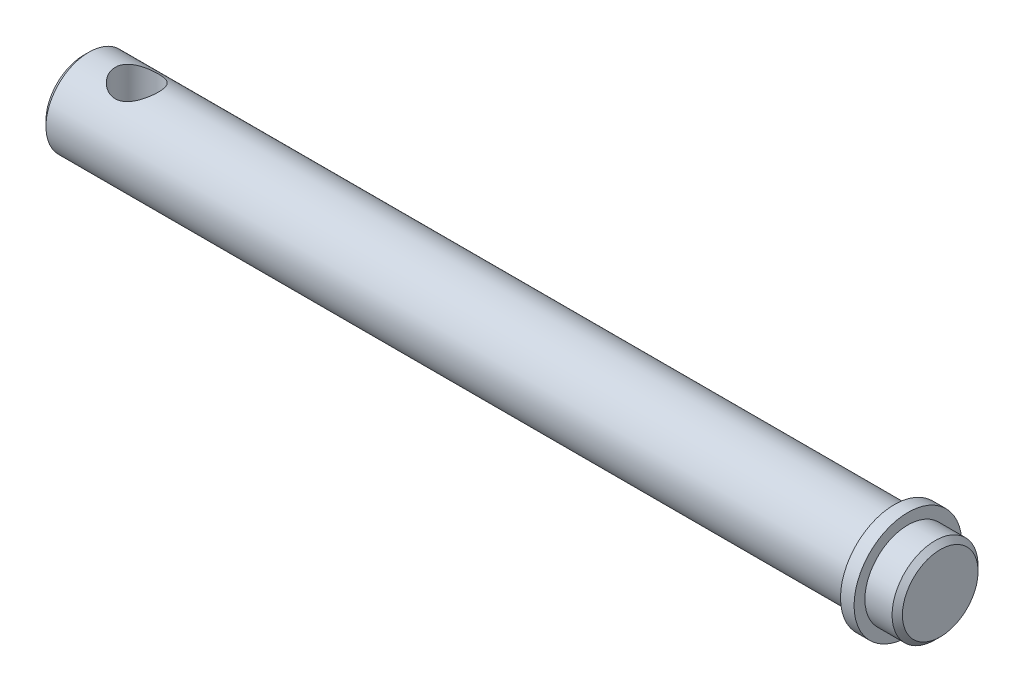
ISO-10303-21;
HEADER;
FILE_DESCRIPTION(('STEP AP214'),'2;1');
FILE_NAME('part.step','',(''),(''),'','','');
FILE_SCHEMA(('AUTOMOTIVE_DESIGN { 1 0 10303 214 1 1 1 1 }'));
ENDSEC;
DATA;
#1=APPLICATION_CONTEXT('core data for automotive mechanical design processes');
#2=APPLICATION_PROTOCOL_DEFINITION('international standard','automotive_design',2000,#1);
#3=PRODUCT_CONTEXT('',#1,'mechanical');
#4=PRODUCT('Part','Part','',(#3));
#5=PRODUCT_RELATED_PRODUCT_CATEGORY('part','',(#4));
#6=PRODUCT_DEFINITION_FORMATION('','',#4);
#7=PRODUCT_DEFINITION_CONTEXT('part definition',#1,'design');
#8=PRODUCT_DEFINITION('design','',#6,#7);
#9=PRODUCT_DEFINITION_SHAPE('','',#8);
#10=(LENGTH_UNIT() NAMED_UNIT(*) SI_UNIT(.MILLI.,.METRE.));
#11=(NAMED_UNIT(*) PLANE_ANGLE_UNIT() SI_UNIT($,.RADIAN.));
#12=(NAMED_UNIT(*) SI_UNIT($,.STERADIAN.) SOLID_ANGLE_UNIT());
#13=UNCERTAINTY_MEASURE_WITH_UNIT(LENGTH_MEASURE(1.E-05),#10,'distance_accuracy_value','');
#14=(GEOMETRIC_REPRESENTATION_CONTEXT(3) GLOBAL_UNCERTAINTY_ASSIGNED_CONTEXT((#13)) GLOBAL_UNIT_ASSIGNED_CONTEXT((#10,
#11,#12)) REPRESENTATION_CONTEXT('',''));
#15=CARTESIAN_POINT('',(0.,0.,0.));
#16=DIRECTION('',(0.,0.,1.));
#17=DIRECTION('',(1.,0.,0.));
#18=AXIS2_PLACEMENT_3D('',#15,#16,#17);
#19=CARTESIAN_POINT('',(3.38125,0.,0.));
#20=DIRECTION('',(1.,0.,0.));
#21=DIRECTION('',(0.,0.,-1.));
#22=AXIS2_PLACEMENT_3D('',#19,#20,#21);
#23=PLANE('',#22);
#24=CARTESIAN_POINT('',(3.3812500000181,0.,0.));
#25=DIRECTION('',(-1.,0.,0.));
#26=DIRECTION('',(0.,0.,1.));
#27=AXIS2_PLACEMENT_3D('',#24,#25,#26);
#28=CIRCLE('',#27,2.78765000001613);
#29=CARTESIAN_POINT('',(3.3812500000181,0.,2.78765000001613));
#30=VERTEX_POINT('',#29);
#31=EDGE_CURVE('E18',#30,#30,#28,.T.);
#32=ORIENTED_EDGE('',*,*,#31,.F.);
#33=EDGE_LOOP('',(#32));
#34=FACE_BOUND('',#33,.T.);
#35=ADVANCED_FACE('F15',(#34),#23,.T.);
#36=CARTESIAN_POINT('',(3.00025000007054,0.,0.));
#37=DIRECTION('',(-1.,0.,0.));
#38=DIRECTION('',(0.,0.,1.));
#39=AXIS2_PLACEMENT_3D('',#36,#37,#38);
#40=CONICAL_SURFACE('',#39,3.16864999996369,0.785398163397448);
#41=CARTESIAN_POINT('',(3.00025000000003,0.,0.));
#42=DIRECTION('',(-1.,0.,0.));
#43=DIRECTION('',(0.,0.,1.));
#44=AXIS2_PLACEMENT_3D('',#41,#42,#43);
#45=CIRCLE('',#44,3.16865);
#46=CARTESIAN_POINT('',(3.00025000000003,0.,3.16865));
#47=VERTEX_POINT('',#46);
#48=EDGE_CURVE('E34',#47,#47,#45,.T.);
#49=ORIENTED_EDGE('',*,*,#48,.F.);
#50=EDGE_LOOP('',(#49));
#51=FACE_BOUND('',#50,.T.);
#52=ORIENTED_EDGE('',*,*,#31,.T.);
#53=EDGE_LOOP('',(#52));
#54=FACE_BOUND('',#53,.T.);
#55=ADVANCED_FACE('F68',(#51,#54),#40,.T.);
#56=CARTESIAN_POINT('',(3.38125,0.,0.));
#57=DIRECTION('',(-1.,0.,0.));
#58=DIRECTION('',(0.,0.,1.));
#59=AXIS2_PLACEMENT_3D('',#56,#57,#58);
#60=CYLINDRICAL_SURFACE('',#59,3.16865);
#61=CARTESIAN_POINT('',(1.,0.,0.));
#62=DIRECTION('',(-1.,0.,0.));
#63=DIRECTION('',(0.,0.,1.));
#64=AXIS2_PLACEMENT_3D('',#61,#62,#63);
#65=CIRCLE('',#64,3.16865);
#66=CARTESIAN_POINT('',(1.,0.,3.16865));
#67=VERTEX_POINT('',#66);
#68=EDGE_CURVE('E58',#67,#67,#65,.T.);
#69=ORIENTED_EDGE('',*,*,#68,.F.);
#70=EDGE_LOOP('',(#69));
#71=FACE_BOUND('',#70,.T.);
#72=ORIENTED_EDGE('',*,*,#48,.T.);
#73=EDGE_LOOP('',(#72));
#74=FACE_BOUND('',#73,.T.);
#75=ADVANCED_FACE('F75',(#71,#74),#60,.T.);
#76=CARTESIAN_POINT('',(1.,0.,0.));
#77=DIRECTION('',(1.,0.,0.));
#78=DIRECTION('',(0.,0.,-1.));
#79=AXIS2_PLACEMENT_3D('',#76,#77,#78);
#80=PLANE('',#79);
#81=CARTESIAN_POINT('',(1.,0.,0.));
#82=DIRECTION('',(-1.,0.,0.));
#83=DIRECTION('',(0.,0.,1.));
#84=AXIS2_PLACEMENT_3D('',#81,#82,#83);
#85=CIRCLE('',#84,3.96875);
#86=CARTESIAN_POINT('',(1.,0.,3.96875));
#87=VERTEX_POINT('',#86);
#88=EDGE_CURVE('E56',#87,#87,#85,.T.);
#89=ORIENTED_EDGE('',*,*,#88,.F.);
#90=EDGE_LOOP('',(#89));
#91=FACE_BOUND('',#90,.T.);
#92=ORIENTED_EDGE('',*,*,#68,.T.);
#93=EDGE_LOOP('',(#92));
#94=FACE_BOUND('',#93,.T.);
#95=ADVANCED_FACE('F80',(#91,#94),#80,.T.);
#96=CARTESIAN_POINT('',(-59.7281,0.,0.));
#97=DIRECTION('',(1.,0.,0.));
#98=DIRECTION('',(0.,0.,-1.));
#99=AXIS2_PLACEMENT_3D('',#96,#97,#98);
#100=PLANE('',#99);
#101=CARTESIAN_POINT('',(-59.7281000000294,0.,0.));
#102=DIRECTION('',(1.,0.,0.));
#103=DIRECTION('',(0.,0.,-1.));
#104=AXIS2_PLACEMENT_3D('',#101,#102,#103);
#105=CIRCLE('',#104,2.78765000001613);
#106=CARTESIAN_POINT('',(-59.7281000000294,0.,-2.78765000001613));
#107=VERTEX_POINT('',#106);
#108=EDGE_CURVE('E53',#107,#107,#105,.T.);
#109=ORIENTED_EDGE('',*,*,#108,.F.);
#110=EDGE_LOOP('',(#109));
#111=FACE_BOUND('',#110,.T.);
#112=ADVANCED_FACE('F86',(#111),#100,.F.);
#113=CARTESIAN_POINT('',(1.,0.,0.));
#114=DIRECTION('',(-1.,0.,0.));
#115=DIRECTION('',(0.,0.,1.));
#116=AXIS2_PLACEMENT_3D('',#113,#114,#115);
#117=CYLINDRICAL_SURFACE('',#116,3.96875);
#118=ORIENTED_EDGE('',*,*,#88,.T.);
#119=EDGE_LOOP('',(#118));
#120=FACE_BOUND('',#119,.T.);
#121=CARTESIAN_POINT('',(0.,0.,0.));
#122=DIRECTION('',(-1.,0.,0.));
#123=DIRECTION('',(0.,0.,1.));
#124=AXIS2_PLACEMENT_3D('',#121,#122,#123);
#125=CIRCLE('',#124,3.96875);
#126=CARTESIAN_POINT('',(0.,0.,3.96875));
#127=VERTEX_POINT('',#126);
#128=EDGE_CURVE('E50',#127,#127,#125,.F.);
#129=ORIENTED_EDGE('',*,*,#128,.T.);
#130=EDGE_LOOP('',(#129));
#131=FACE_BOUND('',#130,.T.);
#132=ADVANCED_FACE('F90',(#120,#131),#117,.T.);
#133=CARTESIAN_POINT('',(-59.347100000025,0.,0.));
#134=DIRECTION('',(1.,0.,0.));
#135=DIRECTION('',(0.,0.,-1.));
#136=AXIS2_PLACEMENT_3D('',#133,#134,#135);
#137=CONICAL_SURFACE('',#136,3.16865000002053,0.785398163397448);
#138=ORIENTED_EDGE('',*,*,#108,.T.);
#139=EDGE_LOOP('',(#138));
#140=FACE_BOUND('',#139,.T.);
#141=CARTESIAN_POINT('',(-59.3471,0.,0.));
#142=DIRECTION('',(1.,0.,0.));
#143=DIRECTION('',(0.,0.,-1.));
#144=AXIS2_PLACEMENT_3D('',#141,#142,#143);
#145=CIRCLE('',#144,3.16865);
#146=CARTESIAN_POINT('',(-59.3471,0.,-3.16865));
#147=VERTEX_POINT('',#146);
#148=EDGE_CURVE('E27',#147,#147,#145,.T.);
#149=ORIENTED_EDGE('',*,*,#148,.F.);
#150=EDGE_LOOP('',(#149));
#151=FACE_BOUND('',#150,.T.);
#152=ADVANCED_FACE('F94',(#140,#151),#137,.T.);
#153=CARTESIAN_POINT('',(0.,0.,0.));
#154=DIRECTION('',(1.,0.,0.));
#155=DIRECTION('',(0.,0.,-1.));
#156=AXIS2_PLACEMENT_3D('',#153,#154,#155);
#157=PLANE('',#156);
#158=ORIENTED_EDGE('',*,*,#128,.F.);
#159=EDGE_LOOP('',(#158));
#160=FACE_BOUND('',#159,.T.);
#161=CARTESIAN_POINT('',(0.,0.,0.));
#162=DIRECTION('',(1.,0.,0.));
#163=DIRECTION('',(0.,0.,-1.));
#164=AXIS2_PLACEMENT_3D('',#161,#162,#163);
#165=CIRCLE('',#164,3.16865);
#166=CARTESIAN_POINT('',(0.,0.,-3.16865));
#167=VERTEX_POINT('',#166);
#168=EDGE_CURVE('E22',#167,#167,#165,.F.);
#169=ORIENTED_EDGE('',*,*,#168,.F.);
#170=EDGE_LOOP('',(#169));
#171=FACE_BOUND('',#170,.T.);
#172=ADVANCED_FACE('F97',(#160,#171),#157,.F.);
#173=CARTESIAN_POINT('',(-55.82285,-3.96875,0.));
#174=DIRECTION('',(0.,1.,0.));
#175=DIRECTION('',(0.,0.,1.));
#176=AXIS2_PLACEMENT_3D('',#173,#174,#175);
#177=CYLINDRICAL_SURFACE('',#176,1.5875);
#178=CARTESIAN_POINT('',(-55.82285,-2.74229585794458,-1.5875));
#179=CARTESIAN_POINT('',(-55.9056128608954,-2.74230205304848,-1.58749515038066));
#180=CARTESIAN_POINT('',(-55.9884241867237,-2.7460964013297,-1.58098984173726));
#181=CARTESIAN_POINT('',(-56.1514596780011,-2.76071428214469,-1.55531488726197));
#182=CARTESIAN_POINT('',(-56.2316805124963,-2.77154651383126,-1.53612956783731));
#183=CARTESIAN_POINT('',(-56.3869345020776,-2.79866980982646,-1.48613142369349));
#184=CARTESIAN_POINT('',(-56.4619913842614,-2.81493357014481,-1.45537666205425));
#185=CARTESIAN_POINT('',(-56.6058769935454,-2.85104464993752,-1.38329593425752));
#186=CARTESIAN_POINT('',(-56.6747042081732,-2.8708928361735,-1.3419674102149));
#187=CARTESIAN_POINT('',(-56.810447952461,-2.91394110247139,-1.24590512903276));
#188=CARTESIAN_POINT('',(-56.8767351253719,-2.93728263979396,-1.19034511372177));
#189=CARTESIAN_POINT('',(-56.9995383773099,-2.98354538005984,-1.06911651514524));
#190=CARTESIAN_POINT('',(-57.0560499065779,-3.00646638286625,-1.00344325172717));
#191=CARTESIAN_POINT('',(-57.1614488706787,-3.05116393958389,-0.858413264561934));
#192=CARTESIAN_POINT('',(-57.2095602056664,-3.07275769929605,-0.778430875666493));
#193=CARTESIAN_POINT('',(-57.2913571616261,-3.11052722952166,-0.610222718565931));
#194=CARTESIAN_POINT('',(-57.3250518800088,-3.12670641542016,-0.522002191877232));
#195=CARTESIAN_POINT('',(-57.374560509036,-3.15080299825578,-0.346496357708142));
#196=CARTESIAN_POINT('',(-57.3914792709132,-3.1592277768866,-0.259593963082208));
#197=CARTESIAN_POINT('',(-57.4105953609842,-3.16876140714645,-0.0838069649465265));
#198=CARTESIAN_POINT('',(-57.412801587398,-3.16987468080666,0.00507640781010454));
#199=CARTESIAN_POINT('',(-57.4028538643704,-3.16489938824885,0.173991286710071));
#200=CARTESIAN_POINT('',(-57.3919367580649,-3.15943106512849,0.254118148133734));
#201=CARTESIAN_POINT('',(-57.3582671459378,-3.14284556957466,0.411224252664482));
#202=CARTESIAN_POINT('',(-57.3355137996326,-3.13172799599291,0.488203271826595));
#203=CARTESIAN_POINT('',(-57.278672580663,-3.10466981173293,0.638169197263317));
#204=CARTESIAN_POINT('',(-57.2444326099723,-3.08866475416862,0.711086344091614));
#205=CARTESIAN_POINT('',(-57.165802131245,-3.05327293905292,0.850314523334367));
#206=CARTESIAN_POINT('',(-57.1214081526989,-3.03388502582348,0.916623285937231));
#207=CARTESIAN_POINT('',(-57.0189004871744,-2.99137849411592,1.04745647911863));
#208=CARTESIAN_POINT('',(-56.959885574525,-2.96808044932091,1.11121700450977));
#209=CARTESIAN_POINT('',(-56.8322068332282,-2.9215499858255,1.2283608725331));
#210=CARTESIAN_POINT('',(-56.7635339129053,-2.89831765024837,1.28173432300178));
#211=CARTESIAN_POINT('',(-56.613097587644,-2.85293005955333,1.37994421357839));
#212=CARTESIAN_POINT('',(-56.5307756455581,-2.83094082972977,1.42400834333978));
#213=CARTESIAN_POINT('',(-56.3585842012314,-2.79288667777068,1.4972816718654));
#214=CARTESIAN_POINT('',(-56.2687318167621,-2.77680874409718,1.52652355076829));
#215=CARTESIAN_POINT('',(-56.1188489479866,-2.75762752730748,1.56078583172554));
#216=CARTESIAN_POINT('',(-56.0602491843803,-2.75192024145585,1.57077582274131));
#217=CARTESIAN_POINT('',(-55.9420578775871,-2.74425250816196,1.58413406565933));
#218=CARTESIAN_POINT('',(-55.8824665123971,-2.74229139542982,1.58750349332283));
#219=CARTESIAN_POINT('',(-55.7400871391046,-2.74230205304848,1.58749515038066));
#220=CARTESIAN_POINT('',(-55.6572758132763,-2.7460964013297,1.58098984173726));
#221=CARTESIAN_POINT('',(-55.4942403219989,-2.76071428214469,1.55531488726197));
#222=CARTESIAN_POINT('',(-55.4140194875037,-2.77154651383126,1.53612956783731));
#223=CARTESIAN_POINT('',(-55.2587654979224,-2.79866980982646,1.48613142369349));
#224=CARTESIAN_POINT('',(-55.1837086157386,-2.81493357014481,1.45537666205425));
#225=CARTESIAN_POINT('',(-55.0398230064546,-2.85104464993752,1.38329593425752));
#226=CARTESIAN_POINT('',(-54.9709957918269,-2.8708928361735,1.3419674102149));
#227=CARTESIAN_POINT('',(-54.835252047539,-2.91394110247139,1.24590512903276));
#228=CARTESIAN_POINT('',(-54.7689648746281,-2.93728263979396,1.19034511372177));
#229=CARTESIAN_POINT('',(-54.6461616226901,-2.98354538005984,1.06911651514524));
#230=CARTESIAN_POINT('',(-54.5896500934221,-3.00646638286625,1.00344325172717));
#231=CARTESIAN_POINT('',(-54.4842511293213,-3.05116393958389,0.858413264561934));
#232=CARTESIAN_POINT('',(-54.4361397943336,-3.07275769929605,0.778430875666493));
#233=CARTESIAN_POINT('',(-54.3543428383739,-3.11052722952166,0.610222718565931));
#234=CARTESIAN_POINT('',(-54.3206481199912,-3.12670641542016,0.522002191877232));
#235=CARTESIAN_POINT('',(-54.271139490964,-3.15080299825578,0.346496357708142));
#236=CARTESIAN_POINT('',(-54.2542207290868,-3.1592277768866,0.259593963082208));
#237=CARTESIAN_POINT('',(-54.2351046390158,-3.16876140714645,0.0838069649465265));
#238=CARTESIAN_POINT('',(-54.232898412602,-3.16987468080666,-0.00507640781010454));
#239=CARTESIAN_POINT('',(-54.2428461356296,-3.16489938824885,-0.173991286710071));
#240=CARTESIAN_POINT('',(-54.2537632419351,-3.15943106512849,-0.254118148133734));
#241=CARTESIAN_POINT('',(-54.2874328540622,-3.14284556957466,-0.411224252664482));
#242=CARTESIAN_POINT('',(-54.3101862003674,-3.13172799599291,-0.488203271826595));
#243=CARTESIAN_POINT('',(-54.367027419337,-3.10466981173293,-0.638169197263317));
#244=CARTESIAN_POINT('',(-54.4012673900277,-3.08866475416862,-0.711086344091615));
#245=CARTESIAN_POINT('',(-54.479897868755,-3.05327293905292,-0.850314523334368));
#246=CARTESIAN_POINT('',(-54.5242918473011,-3.03388502582348,-0.916623285937231));
#247=CARTESIAN_POINT('',(-54.6267995128256,-2.99137849411592,-1.04745647911863));
#248=CARTESIAN_POINT('',(-54.685814425475,-2.96808044932091,-1.11121700450977));
#249=CARTESIAN_POINT('',(-54.8134931667718,-2.9215499858255,-1.2283608725331));
#250=CARTESIAN_POINT('',(-54.8821660870947,-2.89831765024837,-1.28173432300178));
#251=CARTESIAN_POINT('',(-55.032602412356,-2.85293005955333,-1.37994421357839));
#252=CARTESIAN_POINT('',(-55.1149243544419,-2.83094082972978,-1.42400834333978));
#253=CARTESIAN_POINT('',(-55.2871157987686,-2.79288667777069,-1.4972816718654));
#254=CARTESIAN_POINT('',(-55.3769681832379,-2.77680874409718,-1.52652355076829));
#255=CARTESIAN_POINT('',(-55.5268510520134,-2.75762752730748,-1.56078583172554));
#256=CARTESIAN_POINT('',(-55.5854508156197,-2.75192024145585,-1.57077582274131));
#257=CARTESIAN_POINT('',(-55.7036421224129,-2.74425250816196,-1.58413406565933));
#258=CARTESIAN_POINT('',(-55.7632334876029,-2.74229139542982,-1.58750349332283));
#259=CARTESIAN_POINT('',(-55.82285,-2.74229585794458,-1.5875));
#260=B_SPLINE_CURVE_WITH_KNOTS('',3,(#178,#179,#180,#181,#182,#183,#184,#185,#186,#187,#188,
#189,#190,#191,#192,#193,#194,#195,#196,#197,#198,#199,#200,#201,#202,#203,#204,#205,#206,#207,
#208,#209,#210,#211,#212,#213,#214,#215,#216,#217,#218,#219,#220,#221,#222,#223,#224,#225,#226,
#227,#228,#229,#230,#231,#232,#233,#234,#235,#236,#237,#238,#239,#240,#241,#242,#243,#244,#245,
#246,#247,#248,#249,#250,#251,#252,#253,#254,#255,#256,#257,#258,#259),.UNSPECIFIED.,.T.,.F.,(4,
2,2,2,2,2,2,2,2,2,2,2,2,2,2,2,2,2,2,2,2,2,2,2,2,2,2,2,2,2,2,2,2,2,2,2,2,2,2,2,4),(0.,
0.248046044986333,0.496399271260709,0.743522374836998,0.99070531626056,1.25834169674377,
1.52610230678216,1.81200678181512,2.09773057365492,2.36305508840465,2.62821911890204,
2.87023406247206,3.11226619371131,3.35763870089466,3.6030951989021,3.87180097885465,
4.14076142258377,4.42706329678654,4.71273115578361,4.89143772575195,5.07011255593545,
5.31815860092179,5.56651182719616,5.81363493077245,6.06081787219601,6.32845425267922,
6.5962148627176,6.88211933775057,7.16784312959036,7.4331676443401,7.69833167483748,
7.94034661840751,8.18237874964676,8.42775125683011,8.67320775483754,8.94191353479009,
9.21087397851922,9.49717585272198,9.78284371171905,9.9615502816874,10.1402251118709),.UNSPECIFIED.);
#261=CARTESIAN_POINT('',(-55.82285,-2.74229585794458,-1.5875));
#262=VERTEX_POINT('',#261);
#263=EDGE_CURVE('E10',#262,#262,#260,.T.);
#264=ORIENTED_EDGE('',*,*,#263,.F.);
#265=EDGE_LOOP('',(#264));
#266=FACE_BOUND('',#265,.T.);
#267=CARTESIAN_POINT('',(-55.82285,2.74229585794458,-1.5875));
#268=CARTESIAN_POINT('',(-55.7400871391046,2.74230205304848,-1.58749515038066));
#269=CARTESIAN_POINT('',(-55.6572758132763,2.7460964013297,-1.58098984173726));
#270=CARTESIAN_POINT('',(-55.4942403219989,2.76071428214469,-1.55531488726197));
#271=CARTESIAN_POINT('',(-55.4140194875037,2.77154651383126,-1.53612956783731));
#272=CARTESIAN_POINT('',(-55.2587654979224,2.79866980982646,-1.48613142369349));
#273=CARTESIAN_POINT('',(-55.1837086157386,2.81493357014481,-1.45537666205425));
#274=CARTESIAN_POINT('',(-55.0398230064546,2.85104464993752,-1.38329593425752));
#275=CARTESIAN_POINT('',(-54.9709957918269,2.8708928361735,-1.3419674102149));
#276=CARTESIAN_POINT('',(-54.835252047539,2.91394110247139,-1.24590512903276));
#277=CARTESIAN_POINT('',(-54.7689648746281,2.93728263979396,-1.19034511372177));
#278=CARTESIAN_POINT('',(-54.6461616226901,2.98354538005984,-1.06911651514525));
#279=CARTESIAN_POINT('',(-54.5896500934221,3.00646638286625,-1.00344325172717));
#280=CARTESIAN_POINT('',(-54.4842511293213,3.05116393958389,-0.858413264561934));
#281=CARTESIAN_POINT('',(-54.4361397943336,3.07275769929605,-0.778430875666493));
#282=CARTESIAN_POINT('',(-54.3543428383739,3.11052722952166,-0.610222718565931));
#283=CARTESIAN_POINT('',(-54.3206481199912,3.12670641542016,-0.522002191877232));
#284=CARTESIAN_POINT('',(-54.271139490964,3.15080299825578,-0.346496357708142));
#285=CARTESIAN_POINT('',(-54.2542207290868,3.1592277768866,-0.259593963082208));
#286=CARTESIAN_POINT('',(-54.2351046390158,3.16876140714645,-0.0838069649465265));
#287=CARTESIAN_POINT('',(-54.232898412602,3.16987468080666,0.00507640781010452));
#288=CARTESIAN_POINT('',(-54.2428461356296,3.16489938824885,0.173991286710071));
#289=CARTESIAN_POINT('',(-54.2537632419351,3.15943106512849,0.254118148133735));
#290=CARTESIAN_POINT('',(-54.2874328540622,3.14284556957466,0.411224252664482));
#291=CARTESIAN_POINT('',(-54.3101862003674,3.13172799599291,0.488203271826596));
#292=CARTESIAN_POINT('',(-54.367027419337,3.10466981173293,0.638169197263317));
#293=CARTESIAN_POINT('',(-54.4012673900277,3.08866475416862,0.711086344091614));
#294=CARTESIAN_POINT('',(-54.479897868755,3.05327293905292,0.850314523334367));
#295=CARTESIAN_POINT('',(-54.5242918473011,3.03388502582348,0.916623285937231));
#296=CARTESIAN_POINT('',(-54.6267995128256,2.99137849411592,1.04745647911863));
#297=CARTESIAN_POINT('',(-54.685814425475,2.96808044932091,1.11121700450977));
#298=CARTESIAN_POINT('',(-54.8134931667718,2.9215499858255,1.2283608725331));
#299=CARTESIAN_POINT('',(-54.8821660870947,2.89831765024837,1.28173432300178));
#300=CARTESIAN_POINT('',(-55.032602412356,2.85293005955333,1.37994421357839));
#301=CARTESIAN_POINT('',(-55.1149243544419,2.83094082972978,1.42400834333978));
#302=CARTESIAN_POINT('',(-55.2871157987686,2.79288667777069,1.4972816718654));
#303=CARTESIAN_POINT('',(-55.3769681832379,2.77680874409718,1.52652355076829));
#304=CARTESIAN_POINT('',(-55.5268510520134,2.75762752730748,1.56078583172554));
#305=CARTESIAN_POINT('',(-55.5854508156197,2.75192024145585,1.57077582274131));
#306=CARTESIAN_POINT('',(-55.7036421224129,2.74425250816196,1.58413406565933));
#307=CARTESIAN_POINT('',(-55.7632334876029,2.74229139542982,1.58750349332283));
#308=CARTESIAN_POINT('',(-55.9056128608954,2.74230205304848,1.58749515038066));
#309=CARTESIAN_POINT('',(-55.9884241867237,2.7460964013297,1.58098984173726));
#310=CARTESIAN_POINT('',(-56.1514596780011,2.76071428214469,1.55531488726197));
#311=CARTESIAN_POINT('',(-56.2316805124963,2.77154651383126,1.53612956783731));
#312=CARTESIAN_POINT('',(-56.3869345020776,2.79866980982646,1.48613142369349));
#313=CARTESIAN_POINT('',(-56.4619913842614,2.81493357014481,1.45537666205425));
#314=CARTESIAN_POINT('',(-56.6058769935454,2.85104464993752,1.38329593425752));
#315=CARTESIAN_POINT('',(-56.6747042081732,2.8708928361735,1.3419674102149));
#316=CARTESIAN_POINT('',(-56.810447952461,2.91394110247139,1.24590512903276));
#317=CARTESIAN_POINT('',(-56.8767351253719,2.93728263979396,1.19034511372177));
#318=CARTESIAN_POINT('',(-56.9995383773099,2.98354538005984,1.06911651514524));
#319=CARTESIAN_POINT('',(-57.0560499065779,3.00646638286625,1.00344325172717));
#320=CARTESIAN_POINT('',(-57.1614488706787,3.05116393958389,0.858413264561934));
#321=CARTESIAN_POINT('',(-57.2095602056664,3.07275769929605,0.778430875666493));
#322=CARTESIAN_POINT('',(-57.2913571616261,3.11052722952166,0.610222718565931));
#323=CARTESIAN_POINT('',(-57.3250518800088,3.12670641542016,0.522002191877232));
#324=CARTESIAN_POINT('',(-57.374560509036,3.15080299825578,0.346496357708142));
#325=CARTESIAN_POINT('',(-57.3914792709132,3.1592277768866,0.259593963082208));
#326=CARTESIAN_POINT('',(-57.4105953609842,3.16876140714645,0.0838069649465265));
#327=CARTESIAN_POINT('',(-57.412801587398,3.16987468080666,-0.00507640781010456));
#328=CARTESIAN_POINT('',(-57.4028538643704,3.16489938824885,-0.173991286710071));
#329=CARTESIAN_POINT('',(-57.3919367580649,3.15943106512849,-0.254118148133735));
#330=CARTESIAN_POINT('',(-57.3582671459378,3.14284556957466,-0.411224252664483));
#331=CARTESIAN_POINT('',(-57.3355137996326,3.13172799599291,-0.488203271826596));
#332=CARTESIAN_POINT('',(-57.278672580663,3.10466981173293,-0.638169197263317));
#333=CARTESIAN_POINT('',(-57.2444326099723,3.08866475416862,-0.711086344091615));
#334=CARTESIAN_POINT('',(-57.165802131245,3.05327293905292,-0.850314523334368));
#335=CARTESIAN_POINT('',(-57.1214081526989,3.03388502582348,-0.916623285937231));
#336=CARTESIAN_POINT('',(-57.0189004871744,2.99137849411592,-1.04745647911863));
#337=CARTESIAN_POINT('',(-56.959885574525,2.96808044932091,-1.11121700450977));
#338=CARTESIAN_POINT('',(-56.8322068332282,2.9215499858255,-1.2283608725331));
#339=CARTESIAN_POINT('',(-56.7635339129053,2.89831765024837,-1.28173432300178));
#340=CARTESIAN_POINT('',(-56.613097587644,2.85293005955333,-1.37994421357839));
#341=CARTESIAN_POINT('',(-56.5307756455581,2.83094082972978,-1.42400834333978));
#342=CARTESIAN_POINT('',(-56.3585842012314,2.79288667777069,-1.4972816718654));
#343=CARTESIAN_POINT('',(-56.2687318167621,2.77680874409718,-1.52652355076829));
#344=CARTESIAN_POINT('',(-56.1188489479866,2.75762752730748,-1.56078583172554));
#345=CARTESIAN_POINT('',(-56.0602491843803,2.75192024145585,-1.57077582274131));
#346=CARTESIAN_POINT('',(-55.9420578775871,2.74425250816196,-1.58413406565933));
#347=CARTESIAN_POINT('',(-55.8824665123971,2.74229139542982,-1.58750349332283));
#348=CARTESIAN_POINT('',(-55.82285,2.74229585794458,-1.5875));
#349=B_SPLINE_CURVE_WITH_KNOTS('',3,(#267,#268,#269,#270,#271,#272,#273,#274,#275,#276,#277,
#278,#279,#280,#281,#282,#283,#284,#285,#286,#287,#288,#289,#290,#291,#292,#293,#294,#295,#296,
#297,#298,#299,#300,#301,#302,#303,#304,#305,#306,#307,#308,#309,#310,#311,#312,#313,#314,#315,
#316,#317,#318,#319,#320,#321,#322,#323,#324,#325,#326,#327,#328,#329,#330,#331,#332,#333,#334,
#335,#336,#337,#338,#339,#340,#341,#342,#343,#344,#345,#346,#347,#348),.UNSPECIFIED.,.T.,.F.,(4,
2,2,2,2,2,2,2,2,2,2,2,2,2,2,2,2,2,2,2,2,2,2,2,2,2,2,2,2,2,2,2,2,2,2,2,2,2,2,2,4),(0.,
0.248046044986333,0.496399271260709,0.743522374836998,0.99070531626056,1.25834169674376,
1.52610230678216,1.81200678181512,2.09773057365492,2.36305508840465,2.62821911890204,
2.87023406247206,3.11226619371131,3.35763870089466,3.6030951989021,3.87180097885465,
4.14076142258377,4.42706329678653,4.71273115578361,4.89143772575195,5.07011255593545,
5.31815860092179,5.56651182719616,5.81363493077245,6.06081787219601,6.32845425267922,
6.5962148627176,6.88211933775057,7.16784312959037,7.4331676443401,7.69833167483748,
7.94034661840751,8.18237874964676,8.42775125683012,8.67320775483755,8.94191353479009,
9.21087397851922,9.49717585272198,9.78284371171906,9.9615502816874,10.1402251118709),.UNSPECIFIED.);
#350=CARTESIAN_POINT('',(-55.82285,2.74229585794458,-1.5875));
#351=VERTEX_POINT('',#350);
#352=EDGE_CURVE('E45',#351,#351,#349,.T.);
#353=ORIENTED_EDGE('',*,*,#352,.F.);
#354=EDGE_LOOP('',(#353));
#355=FACE_BOUND('',#354,.T.);
#356=ADVANCED_FACE('F37',(#266,#355),#177,.F.);
#357=CARTESIAN_POINT('',(-59.7281,0.,0.));
#358=DIRECTION('',(1.,0.,0.));
#359=DIRECTION('',(0.,0.,-1.));
#360=AXIS2_PLACEMENT_3D('',#357,#358,#359);
#361=CYLINDRICAL_SURFACE('',#360,3.16865);
#362=ORIENTED_EDGE('',*,*,#148,.T.);
#363=EDGE_LOOP('',(#362));
#364=FACE_BOUND('',#363,.T.);
#365=ORIENTED_EDGE('',*,*,#263,.T.);
#366=EDGE_LOOP('',(#365));
#367=FACE_BOUND('',#366,.T.);
#368=ORIENTED_EDGE('',*,*,#168,.T.);
#369=EDGE_LOOP('',(#368));
#370=FACE_BOUND('',#369,.T.);
#371=ORIENTED_EDGE('',*,*,#352,.T.);
#372=EDGE_LOOP('',(#371));
#373=FACE_BOUND('',#372,.T.);
#374=ADVANCED_FACE('F40',(#364,#367,#370,#373),#361,.T.);
#375=CLOSED_SHELL('',(#35,#55,#75,#95,#112,#132,#152,#172,#356,#374));
#376=MANIFOLD_SOLID_BREP('B1',#375);
#377=ADVANCED_BREP_SHAPE_REPRESENTATION('',(#18,#376),#14);
#378=SHAPE_DEFINITION_REPRESENTATION(#9,#377);
ENDSEC;
END-ISO-10303-21;
